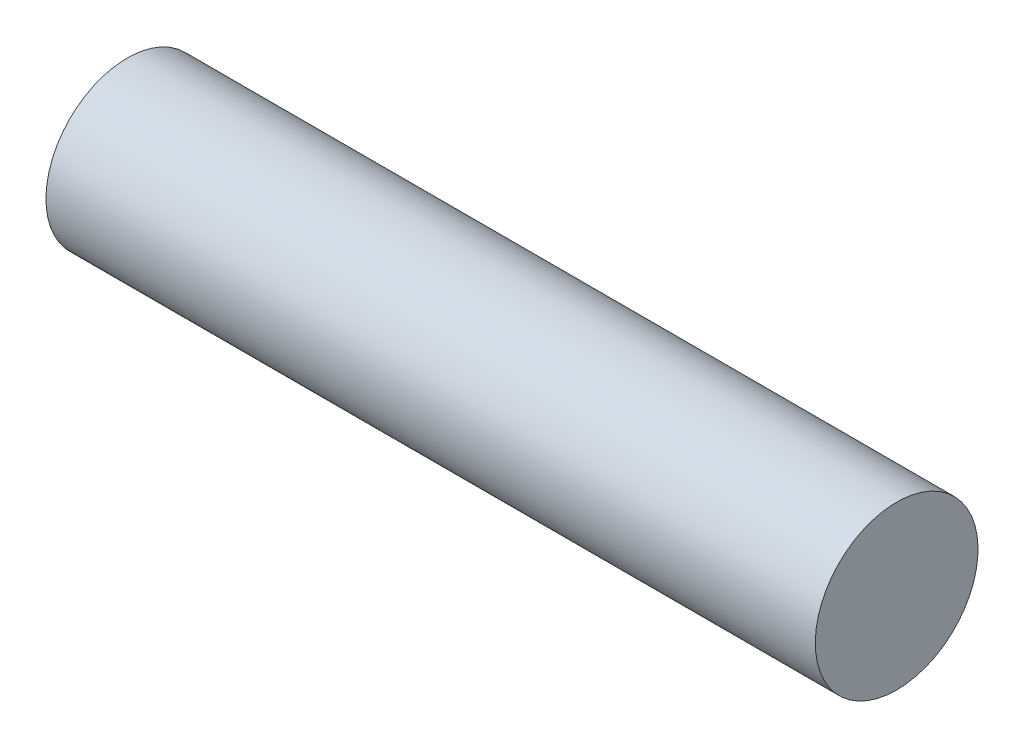
ISO-10303-21;
HEADER;
FILE_DESCRIPTION(('STEP AP214'),'2;1');
FILE_NAME('part.step','',(''),(''),'','','');
FILE_SCHEMA(('AUTOMOTIVE_DESIGN { 1 0 10303 214 1 1 1 1 }'));
ENDSEC;
DATA;
#1=APPLICATION_CONTEXT('core data for automotive mechanical design processes');
#2=APPLICATION_PROTOCOL_DEFINITION('international standard','automotive_design',2000,#1);
#3=PRODUCT_CONTEXT('',#1,'mechanical');
#4=PRODUCT('Part','Part','',(#3));
#5=PRODUCT_RELATED_PRODUCT_CATEGORY('part','',(#4));
#6=PRODUCT_DEFINITION_FORMATION('','',#4);
#7=PRODUCT_DEFINITION_CONTEXT('part definition',#1,'design');
#8=PRODUCT_DEFINITION('design','',#6,#7);
#9=PRODUCT_DEFINITION_SHAPE('','',#8);
#10=(LENGTH_UNIT() NAMED_UNIT(*) SI_UNIT(.MILLI.,.METRE.));
#11=(NAMED_UNIT(*) PLANE_ANGLE_UNIT() SI_UNIT($,.RADIAN.));
#12=(NAMED_UNIT(*) SI_UNIT($,.STERADIAN.) SOLID_ANGLE_UNIT());
#13=UNCERTAINTY_MEASURE_WITH_UNIT(LENGTH_MEASURE(1.E-05),#10,'distance_accuracy_value','');
#14=(GEOMETRIC_REPRESENTATION_CONTEXT(3) GLOBAL_UNCERTAINTY_ASSIGNED_CONTEXT((#13)) GLOBAL_UNIT_ASSIGNED_CONTEXT((#10,
#11,#12)) REPRESENTATION_CONTEXT('',''));
#15=CARTESIAN_POINT('',(0.,0.,0.));
#16=DIRECTION('',(0.,0.,1.));
#17=DIRECTION('',(1.,0.,0.));
#18=AXIS2_PLACEMENT_3D('',#15,#16,#17);
#19=CARTESIAN_POINT('',(-26.,5.5,0.));
#20=DIRECTION('',(1.,0.,0.));
#21=DIRECTION('',(0.,1.,0.));
#22=AXIS2_PLACEMENT_3D('',#19,#20,#21);
#23=PLANE('',#22);
#24=CARTESIAN_POINT('',(-26.,0.,0.));
#25=DIRECTION('',(-1.,0.,0.));
#26=DIRECTION('',(0.,-1.,0.));
#27=AXIS2_PLACEMENT_3D('',#24,#25,#26);
#28=CIRCLE('',#27,5.5);
#29=CARTESIAN_POINT('',(-26.,-5.5,0.));
#30=VERTEX_POINT('',#29);
#31=EDGE_CURVE('E50',#30,#30,#28,.T.);
#32=ORIENTED_EDGE('',*,*,#31,.T.);
#33=EDGE_LOOP('',(#32));
#34=FACE_BOUND('',#33,.T.);
#35=ADVANCED_FACE('F43',(#34),#23,.F.);
#36=CARTESIAN_POINT('',(26.,0.,0.));
#37=DIRECTION('',(-1.,0.,0.));
#38=DIRECTION('',(0.,-1.,0.));
#39=AXIS2_PLACEMENT_3D('',#36,#37,#38);
#40=PLANE('',#39);
#41=CARTESIAN_POINT('',(26.,0.,0.));
#42=DIRECTION('',(-1.,0.,0.));
#43=DIRECTION('',(0.,-1.,0.));
#44=AXIS2_PLACEMENT_3D('',#41,#42,#43);
#45=CIRCLE('',#44,5.5);
#46=CARTESIAN_POINT('',(26.,-5.49999999999999,0.));
#47=VERTEX_POINT('',#46);
#48=EDGE_CURVE('E10',#47,#47,#45,.T.);
#49=ORIENTED_EDGE('',*,*,#48,.F.);
#50=EDGE_LOOP('',(#49));
#51=FACE_BOUND('',#50,.T.);
#52=ADVANCED_FACE('F60',(#51),#40,.F.);
#53=CARTESIAN_POINT('',(-26.,0.,0.));
#54=DIRECTION('',(-1.,0.,0.));
#55=DIRECTION('',(0.,-1.,0.));
#56=AXIS2_PLACEMENT_3D('',#53,#54,#55);
#57=CYLINDRICAL_SURFACE('',#56,5.5);
#58=ORIENTED_EDGE('',*,*,#31,.F.);
#59=EDGE_LOOP('',(#58));
#60=FACE_BOUND('',#59,.T.);
#61=ORIENTED_EDGE('',*,*,#48,.T.);
#62=EDGE_LOOP('',(#61));
#63=FACE_BOUND('',#62,.T.);
#64=ADVANCED_FACE('F58',(#60,#63),#57,.T.);
#65=CLOSED_SHELL('',(#35,#52,#64));
#66=MANIFOLD_SOLID_BREP('B2',#65);
#67=ADVANCED_BREP_SHAPE_REPRESENTATION('',(#18,#66),#14);
#68=SHAPE_DEFINITION_REPRESENTATION(#9,#67);
ENDSEC;
END-ISO-10303-21;
